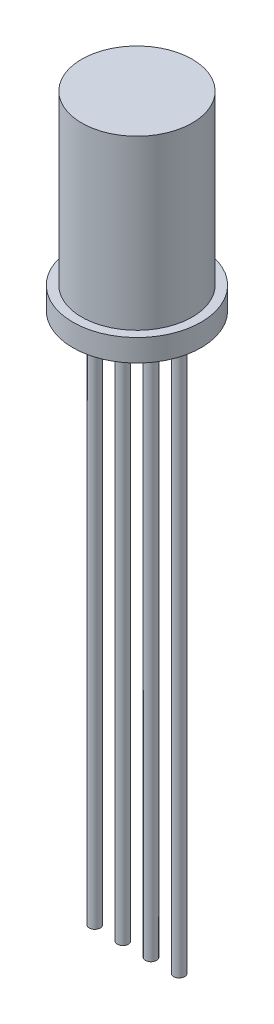
ISO-10303-21;
HEADER;
FILE_DESCRIPTION(('STEP AP214'),'2;1');
FILE_NAME('part.step','',(''),(''),'','','');
FILE_SCHEMA(('AUTOMOTIVE_DESIGN { 1 0 10303 214 1 1 1 1 }'));
ENDSEC;
DATA;
#1=APPLICATION_CONTEXT('core data for automotive mechanical design processes');
#2=APPLICATION_PROTOCOL_DEFINITION('international standard','automotive_design',2000,#1);
#3=PRODUCT_CONTEXT('',#1,'mechanical');
#4=PRODUCT('Part','Part','',(#3));
#5=PRODUCT_RELATED_PRODUCT_CATEGORY('part','',(#4));
#6=PRODUCT_DEFINITION_FORMATION('','',#4);
#7=PRODUCT_DEFINITION_CONTEXT('part definition',#1,'design');
#8=PRODUCT_DEFINITION('design','',#6,#7);
#9=PRODUCT_DEFINITION_SHAPE('','',#8);
#10=(LENGTH_UNIT() NAMED_UNIT(*) SI_UNIT(.MILLI.,.METRE.));
#11=(NAMED_UNIT(*) PLANE_ANGLE_UNIT() SI_UNIT($,.RADIAN.));
#12=(NAMED_UNIT(*) SI_UNIT($,.STERADIAN.) SOLID_ANGLE_UNIT());
#13=UNCERTAINTY_MEASURE_WITH_UNIT(LENGTH_MEASURE(1.E-05),#10,'distance_accuracy_value','');
#14=(GEOMETRIC_REPRESENTATION_CONTEXT(3) GLOBAL_UNCERTAINTY_ASSIGNED_CONTEXT((#13)) GLOBAL_UNIT_ASSIGNED_CONTEXT((#10,
#11,#12)) REPRESENTATION_CONTEXT('',''));
#15=CARTESIAN_POINT('',(0.,0.,0.));
#16=DIRECTION('',(0.,0.,1.));
#17=DIRECTION('',(1.,0.,0.));
#18=AXIS2_PLACEMENT_3D('',#15,#16,#17);
#19=CARTESIAN_POINT('',(0.,8.6,0.));
#20=DIRECTION('',(0.,-1.,0.));
#21=DIRECTION('',(0.,0.,-1.));
#22=AXIS2_PLACEMENT_3D('',#19,#20,#21);
#23=CYLINDRICAL_SURFACE('',#22,2.5);
#24=CARTESIAN_POINT('',(0.,8.6,0.));
#25=DIRECTION('',(0.,1.,0.));
#26=DIRECTION('',(0.,0.,1.));
#27=AXIS2_PLACEMENT_3D('',#24,#25,#26);
#28=CIRCLE('',#27,2.5);
#29=CARTESIAN_POINT('',(0.,8.6,-2.5));
#30=VERTEX_POINT('',#29);
#31=EDGE_CURVE('E11',#30,#30,#28,.T.);
#32=CARTESIAN_POINT('',(0.,1.,0.));
#33=DIRECTION('',(0.,1.,0.));
#34=DIRECTION('',(0.,0.,1.));
#35=AXIS2_PLACEMENT_3D('',#32,#33,#34);
#36=CIRCLE('',#35,2.5);
#37=CARTESIAN_POINT('',(0.,1.,-2.5));
#38=VERTEX_POINT('',#37);
#39=EDGE_CURVE('E60',#38,#38,#36,.T.);
#40=CARTESIAN_POINT('',(0.,8.6,-2.5));
#41=CARTESIAN_POINT('',(0.,8.52083333333333,-2.5));
#42=CARTESIAN_POINT('',(0.,8.44166666666666,-2.5));
#43=CARTESIAN_POINT('',(0.,8.28333333333333,-2.5));
#44=CARTESIAN_POINT('',(0.,8.20416666666667,-2.5));
#45=CARTESIAN_POINT('',(0.,8.04583333333333,-2.5));
#46=CARTESIAN_POINT('',(0.,7.96666666666667,-2.5));
#47=CARTESIAN_POINT('',(0.,7.80833333333333,-2.5));
#48=CARTESIAN_POINT('',(0.,7.72916666666667,-2.5));
#49=CARTESIAN_POINT('',(0.,7.57083333333333,-2.5));
#50=CARTESIAN_POINT('',(0.,7.49166666666667,-2.5));
#51=CARTESIAN_POINT('',(0.,7.33333333333333,-2.5));
#52=CARTESIAN_POINT('',(0.,7.25416666666667,-2.5));
#53=CARTESIAN_POINT('',(0.,7.09583333333333,-2.5));
#54=CARTESIAN_POINT('',(0.,7.01666666666667,-2.5));
#55=CARTESIAN_POINT('',(0.,6.85833333333333,-2.5));
#56=CARTESIAN_POINT('',(0.,6.77916666666667,-2.5));
#57=CARTESIAN_POINT('',(0.,6.62083333333333,-2.5));
#58=CARTESIAN_POINT('',(0.,6.54166666666667,-2.5));
#59=CARTESIAN_POINT('',(0.,6.38333333333333,-2.5));
#60=CARTESIAN_POINT('',(0.,6.30416666666667,-2.5));
#61=CARTESIAN_POINT('',(0.,6.14583333333333,-2.5));
#62=CARTESIAN_POINT('',(0.,6.06666666666667,-2.5));
#63=CARTESIAN_POINT('',(0.,5.90833333333333,-2.5));
#64=CARTESIAN_POINT('',(0.,5.82916666666667,-2.5));
#65=CARTESIAN_POINT('',(0.,5.67083333333333,-2.5));
#66=CARTESIAN_POINT('',(0.,5.59166666666667,-2.5));
#67=CARTESIAN_POINT('',(0.,5.43333333333333,-2.5));
#68=CARTESIAN_POINT('',(0.,5.35416666666667,-2.5));
#69=CARTESIAN_POINT('',(0.,5.19583333333333,-2.5));
#70=CARTESIAN_POINT('',(0.,5.11666666666667,-2.5));
#71=CARTESIAN_POINT('',(0.,4.95833333333333,-2.5));
#72=CARTESIAN_POINT('',(0.,4.87916666666667,-2.5));
#73=CARTESIAN_POINT('',(0.,4.72083333333333,-2.5));
#74=CARTESIAN_POINT('',(0.,4.64166666666667,-2.5));
#75=CARTESIAN_POINT('',(0.,4.48333333333333,-2.5));
#76=CARTESIAN_POINT('',(0.,4.40416666666667,-2.5));
#77=CARTESIAN_POINT('',(0.,4.24583333333333,-2.5));
#78=CARTESIAN_POINT('',(0.,4.16666666666667,-2.5));
#79=CARTESIAN_POINT('',(0.,4.00833333333333,-2.5));
#80=CARTESIAN_POINT('',(0.,3.92916666666667,-2.5));
#81=CARTESIAN_POINT('',(0.,3.77083333333333,-2.5));
#82=CARTESIAN_POINT('',(0.,3.69166666666667,-2.5));
#83=CARTESIAN_POINT('',(0.,3.53333333333333,-2.5));
#84=CARTESIAN_POINT('',(0.,3.45416666666667,-2.5));
#85=CARTESIAN_POINT('',(0.,3.29583333333333,-2.5));
#86=CARTESIAN_POINT('',(0.,3.21666666666667,-2.5));
#87=CARTESIAN_POINT('',(0.,3.05833333333333,-2.5));
#88=CARTESIAN_POINT('',(0.,2.97916666666667,-2.5));
#89=CARTESIAN_POINT('',(0.,2.82083333333333,-2.5));
#90=CARTESIAN_POINT('',(0.,2.74166666666667,-2.5));
#91=CARTESIAN_POINT('',(0.,2.58333333333333,-2.5));
#92=CARTESIAN_POINT('',(0.,2.50416666666667,-2.5));
#93=CARTESIAN_POINT('',(0.,2.34583333333333,-2.5));
#94=CARTESIAN_POINT('',(0.,2.26666666666667,-2.5));
#95=CARTESIAN_POINT('',(0.,2.10833333333333,-2.5));
#96=CARTESIAN_POINT('',(0.,2.02916666666667,-2.5));
#97=CARTESIAN_POINT('',(0.,1.87083333333333,-2.5));
#98=CARTESIAN_POINT('',(0.,1.79166666666667,-2.5));
#99=CARTESIAN_POINT('',(0.,1.63333333333333,-2.5));
#100=CARTESIAN_POINT('',(0.,1.55416666666667,-2.5));
#101=CARTESIAN_POINT('',(0.,1.39583333333333,-2.5));
#102=CARTESIAN_POINT('',(0.,1.31666666666667,-2.5));
#103=CARTESIAN_POINT('',(0.,1.15833333333333,-2.5));
#104=CARTESIAN_POINT('',(0.,1.07916666666667,-2.5));
#105=CARTESIAN_POINT('',(0.,1.,-2.5));
#106=B_SPLINE_CURVE_WITH_KNOTS('',3,(#40,#41,#42,#43,#44,#45,#46,#47,#48,#49,#50,#51,#52,#53,
#54,#55,#56,#57,#58,#59,#60,#61,#62,#63,#64,#65,#66,#67,#68,#69,#70,#71,#72,#73,#74,#75,#76,#77,
#78,#79,#80,#81,#82,#83,#84,#85,#86,#87,#88,#89,#90,#91,#92,#93,#94,#95,#96,#97,#98,#99,#100,
#101,#102,#103,#104,#105),.UNSPECIFIED.,.F.,.F.,(4,2,2,2,2,2,2,2,2,2,2,2,2,2,2,2,2,2,2,2,2,2,2,
2,2,2,2,2,2,2,2,2,4),(0.,0.237500000000002,0.475000000000001,0.712500000000001,
0.950000000000001,1.1875,1.425,1.6625,1.9,2.1375,2.375,2.6125,2.85,3.0875,3.325,3.5625,3.8,
4.0375,4.275,4.5125,4.75,4.9875,5.225,5.4625,5.7,5.9375,6.175,6.4125,6.65,6.8875,7.125,7.3625,
7.6),.UNSPECIFIED.);
#107=EDGE_CURVE('BSEAM53',#30,#38,#106,.T.);
#108=ORIENTED_EDGE('',*,*,#31,.F.);
#109=ORIENTED_EDGE('',*,*,#39,.T.);
#110=ORIENTED_EDGE('',*,*,#107,.T.);
#111=ORIENTED_EDGE('',*,*,#107,.F.);
#112=EDGE_LOOP('',(#108,#110,#109,#111));
#113=FACE_BOUND('',#112,.T.);
#114=ADVANCED_FACE('F53',(#113),#23,.T.);
#115=CARTESIAN_POINT('',(0.,8.6,0.));
#116=DIRECTION('',(0.,1.,0.));
#117=DIRECTION('',(0.,0.,1.));
#118=AXIS2_PLACEMENT_3D('',#115,#116,#117);
#119=PLANE('',#118);
#120=ORIENTED_EDGE('',*,*,#31,.T.);
#121=EDGE_LOOP('',(#120));
#122=FACE_BOUND('',#121,.T.);
#123=ADVANCED_FACE('F66',(#122),#119,.T.);
#124=CARTESIAN_POINT('',(0.,1.,0.));
#125=DIRECTION('',(0.,1.,0.));
#126=DIRECTION('',(0.,0.,1.));
#127=AXIS2_PLACEMENT_3D('',#124,#125,#126);
#128=PLANE('',#127);
#129=ORIENTED_EDGE('',*,*,#39,.F.);
#130=EDGE_LOOP('',(#129));
#131=FACE_BOUND('',#130,.T.);
#132=ADVANCED_FACE('F69',(#131),#128,.F.);
#133=CLOSED_SHELL('',(#114,#123,#132));
#134=MANIFOLD_SOLID_BREP('B2',#133);
#135=CARTESIAN_POINT('',(0.,1.,0.));
#136=DIRECTION('',(0.,-1.,0.));
#137=DIRECTION('',(0.,0.,-1.));
#138=AXIS2_PLACEMENT_3D('',#135,#136,#137);
#139=CYLINDRICAL_SURFACE('',#138,2.9);
#140=CARTESIAN_POINT('',(0.,1.,0.));
#141=DIRECTION('',(0.,1.,0.));
#142=DIRECTION('',(0.,0.,1.));
#143=AXIS2_PLACEMENT_3D('',#140,#141,#142);
#144=CIRCLE('',#143,2.9);
#145=CARTESIAN_POINT('',(0.,1.,2.9));
#146=VERTEX_POINT('',#145);
#147=EDGE_CURVE('E52',#146,#146,#144,.T.);
#148=ORIENTED_EDGE('',*,*,#147,.F.);
#149=EDGE_LOOP('',(#148));
#150=FACE_BOUND('',#149,.T.);
#151=CARTESIAN_POINT('',(0.,0.,0.));
#152=DIRECTION('',(0.,1.,0.));
#153=DIRECTION('',(0.,0.,1.));
#154=AXIS2_PLACEMENT_3D('',#151,#152,#153);
#155=CIRCLE('',#154,2.9);
#156=CARTESIAN_POINT('',(0.,0.,2.9));
#157=VERTEX_POINT('',#156);
#158=EDGE_CURVE('E119',#157,#157,#155,.T.);
#159=ORIENTED_EDGE('',*,*,#158,.T.);
#160=EDGE_LOOP('',(#159));
#161=FACE_BOUND('',#160,.T.);
#162=ADVANCED_FACE('F113',(#150,#161),#139,.T.);
#163=CARTESIAN_POINT('',(0.,1.,0.));
#164=DIRECTION('',(0.,1.,0.));
#165=DIRECTION('',(0.,0.,1.));
#166=AXIS2_PLACEMENT_3D('',#163,#164,#165);
#167=PLANE('',#166);
#168=ORIENTED_EDGE('',*,*,#147,.T.);
#169=EDGE_LOOP('',(#168));
#170=FACE_BOUND('',#169,.T.);
#171=ADVANCED_FACE('F128',(#170),#167,.T.);
#172=CARTESIAN_POINT('',(0.,0.,0.));
#173=DIRECTION('',(0.,1.,0.));
#174=DIRECTION('',(0.,0.,1.));
#175=AXIS2_PLACEMENT_3D('',#172,#173,#174);
#176=PLANE('',#175);
#177=ORIENTED_EDGE('',*,*,#158,.F.);
#178=EDGE_LOOP('',(#177));
#179=FACE_BOUND('',#178,.T.);
#180=ADVANCED_FACE('F126',(#179),#176,.F.);
#181=CLOSED_SHELL('',(#162,#171,#180));
#182=MANIFOLD_SOLID_BREP('B6',#181);
#183=CARTESIAN_POINT('',(1.905,0.,0.));
#184=DIRECTION('',(0.,-1.,0.));
#185=DIRECTION('',(0.,0.,-1.));
#186=AXIS2_PLACEMENT_3D('',#183,#184,#185);
#187=CYLINDRICAL_SURFACE('',#186,0.25);
#188=CARTESIAN_POINT('',(1.905,0.,0.));
#189=DIRECTION('',(0.,1.,0.));
#190=DIRECTION('',(0.,0.,1.));
#191=AXIS2_PLACEMENT_3D('',#188,#189,#190);
#192=CIRCLE('',#191,0.25);
#193=CARTESIAN_POINT('',(1.905,0.,0.25));
#194=VERTEX_POINT('',#193);
#195=EDGE_CURVE('E178',#194,#194,#192,.T.);
#196=ORIENTED_EDGE('',*,*,#195,.F.);
#197=EDGE_LOOP('',(#196));
#198=FACE_BOUND('',#197,.T.);
#199=CARTESIAN_POINT('',(1.905,-25.,0.));
#200=DIRECTION('',(0.,1.,0.));
#201=DIRECTION('',(0.,0.,1.));
#202=AXIS2_PLACEMENT_3D('',#199,#200,#201);
#203=CIRCLE('',#202,0.25);
#204=CARTESIAN_POINT('',(1.905,-25.,0.25));
#205=VERTEX_POINT('',#204);
#206=EDGE_CURVE('E111',#205,#205,#203,.T.);
#207=ORIENTED_EDGE('',*,*,#206,.T.);
#208=EDGE_LOOP('',(#207));
#209=FACE_BOUND('',#208,.T.);
#210=ADVANCED_FACE('F177',(#198,#209),#187,.T.);
#211=CARTESIAN_POINT('',(1.905,0.,0.));
#212=DIRECTION('',(0.,1.,0.));
#213=DIRECTION('',(0.,0.,1.));
#214=AXIS2_PLACEMENT_3D('',#211,#212,#213);
#215=PLANE('',#214);
#216=ORIENTED_EDGE('',*,*,#195,.T.);
#217=EDGE_LOOP('',(#216));
#218=FACE_BOUND('',#217,.T.);
#219=ADVANCED_FACE('F180',(#218),#215,.T.);
#220=CARTESIAN_POINT('',(1.905,-25.,0.));
#221=DIRECTION('',(0.,1.,0.));
#222=DIRECTION('',(0.,0.,1.));
#223=AXIS2_PLACEMENT_3D('',#220,#221,#222);
#224=PLANE('',#223);
#225=ORIENTED_EDGE('',*,*,#206,.F.);
#226=EDGE_LOOP('',(#225));
#227=FACE_BOUND('',#226,.T.);
#228=ADVANCED_FACE('F193',(#227),#224,.F.);
#229=CLOSED_SHELL('',(#210,#219,#228));
#230=MANIFOLD_SOLID_BREP('B48',#229);
#231=CARTESIAN_POINT('',(0.635,0.,0.));
#232=DIRECTION('',(0.,-1.,0.));
#233=DIRECTION('',(0.,0.,-1.));
#234=AXIS2_PLACEMENT_3D('',#231,#232,#233);
#235=CYLINDRICAL_SURFACE('',#234,0.25);
#236=CARTESIAN_POINT('',(0.635,0.,0.));
#237=DIRECTION('',(0.,1.,0.));
#238=DIRECTION('',(0.,0.,1.));
#239=AXIS2_PLACEMENT_3D('',#236,#237,#238);
#240=CIRCLE('',#239,0.25);
#241=CARTESIAN_POINT('',(0.635,0.,0.25));
#242=VERTEX_POINT('',#241);
#243=EDGE_CURVE('E242',#242,#242,#240,.T.);
#244=ORIENTED_EDGE('',*,*,#243,.F.);
#245=EDGE_LOOP('',(#244));
#246=FACE_BOUND('',#245,.T.);
#247=CARTESIAN_POINT('',(0.635,-25.,0.));
#248=DIRECTION('',(0.,1.,0.));
#249=DIRECTION('',(0.,0.,1.));
#250=AXIS2_PLACEMENT_3D('',#247,#248,#249);
#251=CIRCLE('',#250,0.25);
#252=CARTESIAN_POINT('',(0.635,-25.,0.25));
#253=VERTEX_POINT('',#252);
#254=EDGE_CURVE('E173',#253,#253,#251,.T.);
#255=ORIENTED_EDGE('',*,*,#254,.T.);
#256=EDGE_LOOP('',(#255));
#257=FACE_BOUND('',#256,.T.);
#258=ADVANCED_FACE('F240',(#246,#257),#235,.T.);
#259=CARTESIAN_POINT('',(0.635,0.,0.));
#260=DIRECTION('',(0.,1.,0.));
#261=DIRECTION('',(0.,0.,1.));
#262=AXIS2_PLACEMENT_3D('',#259,#260,#261);
#263=PLANE('',#262);
#264=ORIENTED_EDGE('',*,*,#243,.T.);
#265=EDGE_LOOP('',(#264));
#266=FACE_BOUND('',#265,.T.);
#267=ADVANCED_FACE('F239',(#266),#263,.T.);
#268=CARTESIAN_POINT('',(0.635,-25.,0.));
#269=DIRECTION('',(0.,1.,0.));
#270=DIRECTION('',(0.,0.,1.));
#271=AXIS2_PLACEMENT_3D('',#268,#269,#270);
#272=PLANE('',#271);
#273=ORIENTED_EDGE('',*,*,#254,.F.);
#274=EDGE_LOOP('',(#273));
#275=FACE_BOUND('',#274,.T.);
#276=ADVANCED_FACE('F258',(#275),#272,.F.);
#277=CLOSED_SHELL('',(#258,#267,#276));
#278=MANIFOLD_SOLID_BREP('B108',#277);
#279=CARTESIAN_POINT('',(-0.635,0.,0.));
#280=DIRECTION('',(0.,-1.,0.));
#281=DIRECTION('',(0.,0.,-1.));
#282=AXIS2_PLACEMENT_3D('',#279,#280,#281);
#283=CYLINDRICAL_SURFACE('',#282,0.25);
#284=CARTESIAN_POINT('',(-0.635,0.,0.));
#285=DIRECTION('',(0.,1.,0.));
#286=DIRECTION('',(0.,0.,1.));
#287=AXIS2_PLACEMENT_3D('',#284,#285,#286);
#288=CIRCLE('',#287,0.25);
#289=CARTESIAN_POINT('',(-0.635,0.,0.25));
#290=VERTEX_POINT('',#289);
#291=EDGE_CURVE('E302',#290,#290,#288,.T.);
#292=ORIENTED_EDGE('',*,*,#291,.F.);
#293=EDGE_LOOP('',(#292));
#294=FACE_BOUND('',#293,.T.);
#295=CARTESIAN_POINT('',(-0.635,-25.,0.));
#296=DIRECTION('',(0.,1.,0.));
#297=DIRECTION('',(0.,0.,1.));
#298=AXIS2_PLACEMENT_3D('',#295,#296,#297);
#299=CIRCLE('',#298,0.25);
#300=CARTESIAN_POINT('',(-0.635,-25.,0.25));
#301=VERTEX_POINT('',#300);
#302=EDGE_CURVE('E237',#301,#301,#299,.T.);
#303=ORIENTED_EDGE('',*,*,#302,.T.);
#304=EDGE_LOOP('',(#303));
#305=FACE_BOUND('',#304,.T.);
#306=ADVANCED_FACE('F300',(#294,#305),#283,.T.);
#307=CARTESIAN_POINT('',(-0.635,0.,0.));
#308=DIRECTION('',(0.,1.,0.));
#309=DIRECTION('',(0.,0.,1.));
#310=AXIS2_PLACEMENT_3D('',#307,#308,#309);
#311=PLANE('',#310);
#312=ORIENTED_EDGE('',*,*,#291,.T.);
#313=EDGE_LOOP('',(#312));
#314=FACE_BOUND('',#313,.T.);
#315=ADVANCED_FACE('F296',(#314),#311,.T.);
#316=CARTESIAN_POINT('',(-0.635,-25.,0.));
#317=DIRECTION('',(0.,1.,0.));
#318=DIRECTION('',(0.,0.,1.));
#319=AXIS2_PLACEMENT_3D('',#316,#317,#318);
#320=PLANE('',#319);
#321=ORIENTED_EDGE('',*,*,#302,.F.);
#322=EDGE_LOOP('',(#321));
#323=FACE_BOUND('',#322,.T.);
#324=ADVANCED_FACE('F316',(#323),#320,.F.);
#325=CLOSED_SHELL('',(#306,#315,#324));
#326=MANIFOLD_SOLID_BREP('B168',#325);
#327=CARTESIAN_POINT('',(-1.905,0.,0.));
#328=DIRECTION('',(0.,-1.,0.));
#329=DIRECTION('',(0.,0.,-1.));
#330=AXIS2_PLACEMENT_3D('',#327,#328,#329);
#331=CYLINDRICAL_SURFACE('',#330,0.25);
#332=CARTESIAN_POINT('',(-1.905,0.,0.));
#333=DIRECTION('',(0.,1.,0.));
#334=DIRECTION('',(0.,0.,1.));
#335=AXIS2_PLACEMENT_3D('',#332,#333,#334);
#336=CIRCLE('',#335,0.25);
#337=CARTESIAN_POINT('',(-1.905,0.,0.25));
#338=VERTEX_POINT('',#337);
#339=EDGE_CURVE('E297',#338,#338,#336,.T.);
#340=ORIENTED_EDGE('',*,*,#339,.F.);
#341=EDGE_LOOP('',(#340));
#342=FACE_BOUND('',#341,.T.);
#343=CARTESIAN_POINT('',(-1.905,-25.,0.));
#344=DIRECTION('',(0.,1.,0.));
#345=DIRECTION('',(0.,0.,1.));
#346=AXIS2_PLACEMENT_3D('',#343,#344,#345);
#347=CIRCLE('',#346,0.25);
#348=CARTESIAN_POINT('',(-1.905,-25.,0.25));
#349=VERTEX_POINT('',#348);
#350=EDGE_CURVE('E354',#349,#349,#347,.T.);
#351=ORIENTED_EDGE('',*,*,#350,.T.);
#352=EDGE_LOOP('',(#351));
#353=FACE_BOUND('',#352,.T.);
#354=ADVANCED_FACE('F348',(#342,#353),#331,.T.);
#355=CARTESIAN_POINT('',(-1.905,0.,0.));
#356=DIRECTION('',(0.,1.,0.));
#357=DIRECTION('',(0.,0.,1.));
#358=AXIS2_PLACEMENT_3D('',#355,#356,#357);
#359=PLANE('',#358);
#360=ORIENTED_EDGE('',*,*,#339,.T.);
#361=EDGE_LOOP('',(#360));
#362=FACE_BOUND('',#361,.T.);
#363=ADVANCED_FACE('F364',(#362),#359,.T.);
#364=CARTESIAN_POINT('',(-1.905,-25.,0.));
#365=DIRECTION('',(0.,1.,0.));
#366=DIRECTION('',(0.,0.,1.));
#367=AXIS2_PLACEMENT_3D('',#364,#365,#366);
#368=PLANE('',#367);
#369=ORIENTED_EDGE('',*,*,#350,.F.);
#370=EDGE_LOOP('',(#369));
#371=FACE_BOUND('',#370,.T.);
#372=ADVANCED_FACE('F361',(#371),#368,.F.);
#373=CLOSED_SHELL('',(#354,#363,#372));
#374=MANIFOLD_SOLID_BREP('B232',#373);
#375=ADVANCED_BREP_SHAPE_REPRESENTATION('',(#18,#134,#182,#230,#278,#326,#374),#14);
#376=SHAPE_DEFINITION_REPRESENTATION(#9,#375);
ENDSEC;
END-ISO-10303-21;
